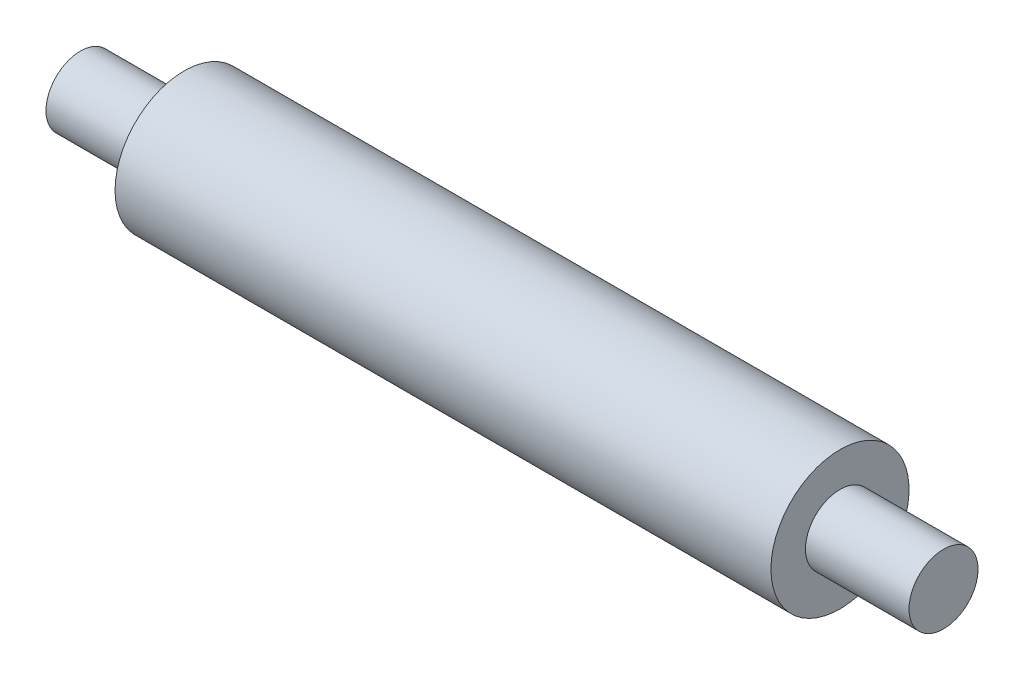
ISO-10303-21;
HEADER;
FILE_DESCRIPTION(('STEP AP214'),'2;1');
FILE_NAME('part.step','',(''),(''),'','','');
FILE_SCHEMA(('AUTOMOTIVE_DESIGN { 1 0 10303 214 1 1 1 1 }'));
ENDSEC;
DATA;
#1=APPLICATION_CONTEXT('core data for automotive mechanical design processes');
#2=APPLICATION_PROTOCOL_DEFINITION('international standard','automotive_design',2000,#1);
#3=PRODUCT_CONTEXT('',#1,'mechanical');
#4=PRODUCT('Part','Part','',(#3));
#5=PRODUCT_RELATED_PRODUCT_CATEGORY('part','',(#4));
#6=PRODUCT_DEFINITION_FORMATION('','',#4);
#7=PRODUCT_DEFINITION_CONTEXT('part definition',#1,'design');
#8=PRODUCT_DEFINITION('design','',#6,#7);
#9=PRODUCT_DEFINITION_SHAPE('','',#8);
#10=(LENGTH_UNIT() NAMED_UNIT(*) SI_UNIT(.MILLI.,.METRE.));
#11=(NAMED_UNIT(*) PLANE_ANGLE_UNIT() SI_UNIT($,.RADIAN.));
#12=(NAMED_UNIT(*) SI_UNIT($,.STERADIAN.) SOLID_ANGLE_UNIT());
#13=UNCERTAINTY_MEASURE_WITH_UNIT(LENGTH_MEASURE(1.E-05),#10,'distance_accuracy_value','');
#14=(GEOMETRIC_REPRESENTATION_CONTEXT(3) GLOBAL_UNCERTAINTY_ASSIGNED_CONTEXT((#13)) GLOBAL_UNIT_ASSIGNED_CONTEXT((#10,
#11,#12)) REPRESENTATION_CONTEXT('',''));
#15=CARTESIAN_POINT('',(0.,0.,0.));
#16=DIRECTION('',(0.,0.,1.));
#17=DIRECTION('',(1.,0.,0.));
#18=AXIS2_PLACEMENT_3D('',#15,#16,#17);
#19=CARTESIAN_POINT('',(-1.39382183908046,0.,0.));
#20=DIRECTION('',(-1.,0.,0.));
#21=DIRECTION('',(0.,0.,1.));
#22=AXIS2_PLACEMENT_3D('',#19,#20,#21);
#23=PLANE('',#22);
#24=CARTESIAN_POINT('',(-1.39382183908046,0.,0.));
#25=DIRECTION('',(-1.,0.,0.));
#26=DIRECTION('',(0.,0.,1.));
#27=AXIS2_PLACEMENT_3D('',#24,#25,#26);
#28=CIRCLE('',#27,0.683);
#29=CARTESIAN_POINT('',(-1.39382183908046,0.,0.683));
#30=VERTEX_POINT('',#29);
#31=EDGE_CURVE('E10',#30,#30,#28,.T.);
#32=ORIENTED_EDGE('',*,*,#31,.T.);
#33=EDGE_LOOP('',(#32));
#34=FACE_BOUND('',#33,.T.);
#35=ADVANCED_FACE('F41',(#34),#23,.T.);
#36=CARTESIAN_POINT('',(-1.8491551724138,0.,0.));
#37=DIRECTION('',(-1.,0.,0.));
#38=DIRECTION('',(0.,0.,1.));
#39=AXIS2_PLACEMENT_3D('',#36,#37,#38);
#40=CYLINDRICAL_SURFACE('',#39,0.683);
#41=CARTESIAN_POINT('',(0.655178160919537,0.,0.));
#42=DIRECTION('',(-1.,0.,0.));
#43=DIRECTION('',(0.,0.,1.));
#44=AXIS2_PLACEMENT_3D('',#41,#42,#43);
#45=CIRCLE('',#44,0.683);
#46=CARTESIAN_POINT('',(0.655178160919537,0.,0.683));
#47=VERTEX_POINT('',#46);
#48=EDGE_CURVE('E48',#47,#47,#45,.T.);
#49=ORIENTED_EDGE('',*,*,#48,.T.);
#50=EDGE_LOOP('',(#49));
#51=FACE_BOUND('',#50,.T.);
#52=ORIENTED_EDGE('',*,*,#31,.F.);
#53=EDGE_LOOP('',(#52));
#54=FACE_BOUND('',#53,.T.);
#55=ADVANCED_FACE('F85',(#51,#54),#40,.T.);
#56=CARTESIAN_POINT('',(0.655178160919537,-0.683,0.));
#57=DIRECTION('',(-1.,0.,0.));
#58=DIRECTION('',(0.,0.,1.));
#59=AXIS2_PLACEMENT_3D('',#56,#57,#58);
#60=PLANE('',#59);
#61=CARTESIAN_POINT('',(0.655178160919536,0.,0.));
#62=DIRECTION('',(-1.,0.,0.));
#63=DIRECTION('',(0.,0.,1.));
#64=AXIS2_PLACEMENT_3D('',#61,#62,#63);
#65=CIRCLE('',#64,1.366);
#66=CARTESIAN_POINT('',(0.655178160919536,0.,1.366));
#67=VERTEX_POINT('',#66);
#68=EDGE_CURVE('E53',#67,#67,#65,.T.);
#69=ORIENTED_EDGE('',*,*,#68,.T.);
#70=EDGE_LOOP('',(#69));
#71=FACE_BOUND('',#70,.T.);
#72=ORIENTED_EDGE('',*,*,#48,.F.);
#73=EDGE_LOOP('',(#72));
#74=FACE_BOUND('',#73,.T.);
#75=ADVANCED_FACE('F89',(#71,#74),#60,.T.);
#76=CARTESIAN_POINT('',(-1.8491551724138,0.,0.));
#77=DIRECTION('',(-1.,0.,0.));
#78=DIRECTION('',(0.,0.,1.));
#79=AXIS2_PLACEMENT_3D('',#76,#77,#78);
#80=CYLINDRICAL_SURFACE('',#79,1.366);
#81=CARTESIAN_POINT('',(13.6321781609195,0.,0.));
#82=DIRECTION('',(-1.,0.,0.));
#83=DIRECTION('',(0.,0.,1.));
#84=AXIS2_PLACEMENT_3D('',#81,#82,#83);
#85=CIRCLE('',#84,1.366);
#86=CARTESIAN_POINT('',(13.6321781609195,0.,1.366));
#87=VERTEX_POINT('',#86);
#88=EDGE_CURVE('E58',#87,#87,#85,.T.);
#89=ORIENTED_EDGE('',*,*,#88,.T.);
#90=EDGE_LOOP('',(#89));
#91=FACE_BOUND('',#90,.T.);
#92=ORIENTED_EDGE('',*,*,#68,.F.);
#93=EDGE_LOOP('',(#92));
#94=FACE_BOUND('',#93,.T.);
#95=ADVANCED_FACE('F93',(#91,#94),#80,.T.);
#96=CARTESIAN_POINT('',(13.6321781609195,-1.366,0.));
#97=DIRECTION('',(1.,0.,0.));
#98=DIRECTION('',(0.,0.,-1.));
#99=AXIS2_PLACEMENT_3D('',#96,#97,#98);
#100=PLANE('',#99);
#101=CARTESIAN_POINT('',(13.6321781609195,0.,0.));
#102=DIRECTION('',(-1.,0.,0.));
#103=DIRECTION('',(0.,0.,1.));
#104=AXIS2_PLACEMENT_3D('',#101,#102,#103);
#105=CIRCLE('',#104,0.683);
#106=CARTESIAN_POINT('',(13.6321781609195,0.,0.683));
#107=VERTEX_POINT('',#106);
#108=EDGE_CURVE('E64',#107,#107,#105,.T.);
#109=ORIENTED_EDGE('',*,*,#108,.T.);
#110=EDGE_LOOP('',(#109));
#111=FACE_BOUND('',#110,.T.);
#112=ORIENTED_EDGE('',*,*,#88,.F.);
#113=EDGE_LOOP('',(#112));
#114=FACE_BOUND('',#113,.T.);
#115=ADVANCED_FACE('F82',(#111,#114),#100,.T.);
#116=CARTESIAN_POINT('',(-1.8491551724138,0.,0.));
#117=DIRECTION('',(-1.,0.,0.));
#118=DIRECTION('',(0.,0.,1.));
#119=AXIS2_PLACEMENT_3D('',#116,#117,#118);
#120=CYLINDRICAL_SURFACE('',#119,0.683);
#121=CARTESIAN_POINT('',(15.6811781609195,0.,0.));
#122=DIRECTION('',(-1.,0.,0.));
#123=DIRECTION('',(0.,0.,1.));
#124=AXIS2_PLACEMENT_3D('',#121,#122,#123);
#125=CIRCLE('',#124,0.683);
#126=CARTESIAN_POINT('',(15.6811781609195,0.,0.683));
#127=VERTEX_POINT('',#126);
#128=EDGE_CURVE('E68',#127,#127,#125,.T.);
#129=ORIENTED_EDGE('',*,*,#128,.T.);
#130=EDGE_LOOP('',(#129));
#131=FACE_BOUND('',#130,.T.);
#132=ORIENTED_EDGE('',*,*,#108,.F.);
#133=EDGE_LOOP('',(#132));
#134=FACE_BOUND('',#133,.T.);
#135=ADVANCED_FACE('F73',(#131,#134),#120,.T.);
#136=CARTESIAN_POINT('',(15.6811781609195,-0.683,0.));
#137=DIRECTION('',(1.,0.,0.));
#138=DIRECTION('',(0.,0.,-1.));
#139=AXIS2_PLACEMENT_3D('',#136,#137,#138);
#140=PLANE('',#139);
#141=ORIENTED_EDGE('',*,*,#128,.F.);
#142=EDGE_LOOP('',(#141));
#143=FACE_BOUND('',#142,.T.);
#144=ADVANCED_FACE('F76',(#143),#140,.T.);
#145=CLOSED_SHELL('',(#35,#55,#75,#95,#115,#135,#144));
#146=MANIFOLD_SOLID_BREP('B2',#145);
#147=ADVANCED_BREP_SHAPE_REPRESENTATION('',(#18,#146),#14);
#148=SHAPE_DEFINITION_REPRESENTATION(#9,#147);
ENDSEC;
END-ISO-10303-21;
